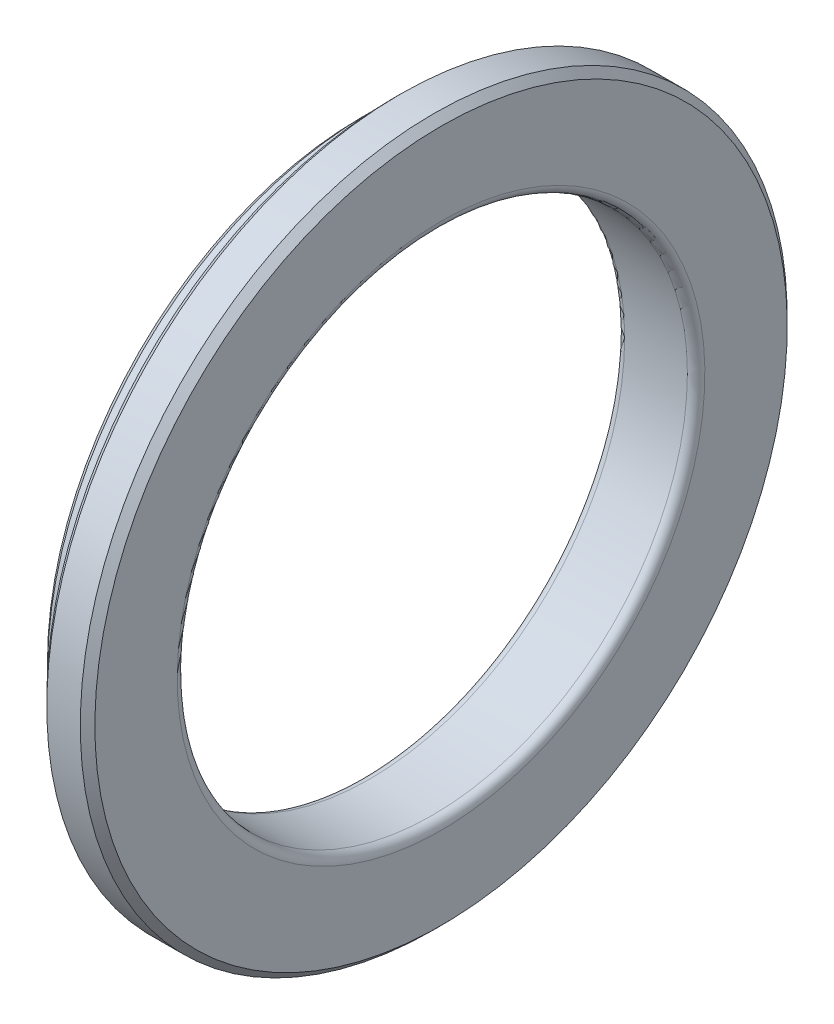
ISO-10303-21;
HEADER;
FILE_DESCRIPTION(('STEP AP214'),'2;1');
FILE_NAME('part.step','',(''),(''),'','','');
FILE_SCHEMA(('AUTOMOTIVE_DESIGN { 1 0 10303 214 1 1 1 1 }'));
ENDSEC;
DATA;
#1=APPLICATION_CONTEXT('core data for automotive mechanical design processes');
#2=APPLICATION_PROTOCOL_DEFINITION('international standard','automotive_design',2000,#1);
#3=PRODUCT_CONTEXT('',#1,'mechanical');
#4=PRODUCT('Part','Part','',(#3));
#5=PRODUCT_RELATED_PRODUCT_CATEGORY('part','',(#4));
#6=PRODUCT_DEFINITION_FORMATION('','',#4);
#7=PRODUCT_DEFINITION_CONTEXT('part definition',#1,'design');
#8=PRODUCT_DEFINITION('design','',#6,#7);
#9=PRODUCT_DEFINITION_SHAPE('','',#8);
#10=(LENGTH_UNIT() NAMED_UNIT(*) SI_UNIT(.MILLI.,.METRE.));
#11=(NAMED_UNIT(*) PLANE_ANGLE_UNIT() SI_UNIT($,.RADIAN.));
#12=(NAMED_UNIT(*) SI_UNIT($,.STERADIAN.) SOLID_ANGLE_UNIT());
#13=UNCERTAINTY_MEASURE_WITH_UNIT(LENGTH_MEASURE(1.E-05),#10,'distance_accuracy_value','');
#14=(GEOMETRIC_REPRESENTATION_CONTEXT(3) GLOBAL_UNCERTAINTY_ASSIGNED_CONTEXT((#13)) GLOBAL_UNIT_ASSIGNED_CONTEXT((#10,
#11,#12)) REPRESENTATION_CONTEXT('',''));
#15=CARTESIAN_POINT('',(0.,0.,0.));
#16=DIRECTION('',(0.,0.,1.));
#17=DIRECTION('',(1.,0.,0.));
#18=AXIS2_PLACEMENT_3D('',#15,#16,#17);
#19=CARTESIAN_POINT('',(-0.25,0.,0.));
#20=DIRECTION('',(1.,0.,0.));
#21=DIRECTION('',(0.,1.,0.));
#22=AXIS2_PLACEMENT_3D('',#19,#20,#21);
#23=CONICAL_SURFACE('',#22,21.75,0.785398163397448);
#24=CARTESIAN_POINT('',(0.,0.,0.));
#25=DIRECTION('',(-1.,0.,0.));
#26=DIRECTION('',(0.,1.,0.));
#27=AXIS2_PLACEMENT_3D('',#24,#25,#26);
#28=CIRCLE('',#27,22.);
#29=CARTESIAN_POINT('',(0.,22.,0.));
#30=VERTEX_POINT('',#29);
#31=EDGE_CURVE('E11',#30,#30,#28,.T.);
#32=ORIENTED_EDGE('',*,*,#31,.T.);
#33=EDGE_LOOP('',(#32));
#34=FACE_BOUND('',#33,.T.);
#35=CARTESIAN_POINT('',(-0.5,0.,0.));
#36=DIRECTION('',(-1.,0.,0.));
#37=DIRECTION('',(0.,1.,0.));
#38=AXIS2_PLACEMENT_3D('',#35,#36,#37);
#39=CIRCLE('',#38,21.5);
#40=CARTESIAN_POINT('',(-0.5,21.5,0.));
#41=VERTEX_POINT('',#40);
#42=EDGE_CURVE('E80',#41,#41,#39,.T.);
#43=ORIENTED_EDGE('',*,*,#42,.F.);
#44=EDGE_LOOP('',(#43));
#45=FACE_BOUND('',#44,.T.);
#46=ADVANCED_FACE('F17',(#34,#45),#23,.T.);
#47=CARTESIAN_POINT('',(0.85,0.,0.));
#48=DIRECTION('',(1.,0.,0.));
#49=DIRECTION('',(0.,1.,0.));
#50=AXIS2_PLACEMENT_3D('',#47,#48,#49);
#51=CYLINDRICAL_SURFACE('',#50,22.);
#52=CARTESIAN_POINT('',(1.7,0.,0.));
#53=DIRECTION('',(-1.,0.,0.));
#54=DIRECTION('',(0.,1.,0.));
#55=AXIS2_PLACEMENT_3D('',#52,#53,#54);
#56=CIRCLE('',#55,22.);
#57=CARTESIAN_POINT('',(1.7,22.,0.));
#58=VERTEX_POINT('',#57);
#59=EDGE_CURVE('E27',#58,#58,#56,.T.);
#60=ORIENTED_EDGE('',*,*,#59,.T.);
#61=EDGE_LOOP('',(#60));
#62=FACE_BOUND('',#61,.T.);
#63=ORIENTED_EDGE('',*,*,#31,.F.);
#64=EDGE_LOOP('',(#63));
#65=FACE_BOUND('',#64,.T.);
#66=ADVANCED_FACE('F92',(#62,#65),#51,.T.);
#67=CARTESIAN_POINT('',(1.7,22.875,0.));
#68=DIRECTION('',(-1.,0.,0.));
#69=DIRECTION('',(0.,1.,0.));
#70=AXIS2_PLACEMENT_3D('',#67,#68,#69);
#71=PLANE('',#70);
#72=CARTESIAN_POINT('',(1.7,0.,0.));
#73=DIRECTION('',(-1.,0.,0.));
#74=DIRECTION('',(0.,1.,0.));
#75=AXIS2_PLACEMENT_3D('',#72,#73,#74);
#76=CIRCLE('',#75,23.75);
#77=CARTESIAN_POINT('',(1.7,23.75,0.));
#78=VERTEX_POINT('',#77);
#79=EDGE_CURVE('E58',#78,#78,#76,.T.);
#80=ORIENTED_EDGE('',*,*,#79,.T.);
#81=EDGE_LOOP('',(#80));
#82=FACE_BOUND('',#81,.T.);
#83=ORIENTED_EDGE('',*,*,#59,.F.);
#84=EDGE_LOOP('',(#83));
#85=FACE_BOUND('',#84,.T.);
#86=ADVANCED_FACE('F19',(#82,#85),#71,.T.);
#87=CARTESIAN_POINT('',(1.95,0.,0.));
#88=DIRECTION('',(1.,0.,0.));
#89=DIRECTION('',(0.,1.,0.));
#90=AXIS2_PLACEMENT_3D('',#87,#88,#89);
#91=CONICAL_SURFACE('',#90,24.,0.785398163397448);
#92=CARTESIAN_POINT('',(2.2,0.,0.));
#93=DIRECTION('',(-1.,0.,0.));
#94=DIRECTION('',(0.,1.,0.));
#95=AXIS2_PLACEMENT_3D('',#92,#93,#94);
#96=CIRCLE('',#95,24.25);
#97=CARTESIAN_POINT('',(2.2,24.25,0.));
#98=VERTEX_POINT('',#97);
#99=EDGE_CURVE('E62',#98,#98,#96,.T.);
#100=ORIENTED_EDGE('',*,*,#99,.T.);
#101=EDGE_LOOP('',(#100));
#102=FACE_BOUND('',#101,.T.);
#103=ORIENTED_EDGE('',*,*,#79,.F.);
#104=EDGE_LOOP('',(#103));
#105=FACE_BOUND('',#104,.T.);
#106=ADVANCED_FACE('F96',(#102,#105),#91,.T.);
#107=CARTESIAN_POINT('',(3.35,0.,0.));
#108=DIRECTION('',(1.,0.,0.));
#109=DIRECTION('',(0.,1.,0.));
#110=AXIS2_PLACEMENT_3D('',#107,#108,#109);
#111=CYLINDRICAL_SURFACE('',#110,24.25);
#112=CARTESIAN_POINT('',(4.5,0.,0.));
#113=DIRECTION('',(-1.,0.,0.));
#114=DIRECTION('',(0.,1.,0.));
#115=AXIS2_PLACEMENT_3D('',#112,#113,#114);
#116=CIRCLE('',#115,24.25);
#117=CARTESIAN_POINT('',(4.5,24.25,0.));
#118=VERTEX_POINT('',#117);
#119=EDGE_CURVE('E21',#118,#118,#116,.T.);
#120=ORIENTED_EDGE('',*,*,#119,.T.);
#121=EDGE_LOOP('',(#120));
#122=FACE_BOUND('',#121,.T.);
#123=ORIENTED_EDGE('',*,*,#99,.F.);
#124=EDGE_LOOP('',(#123));
#125=FACE_BOUND('',#124,.T.);
#126=ADVANCED_FACE('F66',(#122,#125),#111,.T.);
#127=CARTESIAN_POINT('',(4.75,0.,0.));
#128=DIRECTION('',(-1.,0.,0.));
#129=DIRECTION('',(0.,1.,0.));
#130=AXIS2_PLACEMENT_3D('',#127,#128,#129);
#131=CONICAL_SURFACE('',#130,24.,0.785398163397448);
#132=CARTESIAN_POINT('',(5.,0.,0.));
#133=DIRECTION('',(-1.,0.,0.));
#134=DIRECTION('',(0.,1.,0.));
#135=AXIS2_PLACEMENT_3D('',#132,#133,#134);
#136=CIRCLE('',#135,23.75);
#137=CARTESIAN_POINT('',(5.,23.75,0.));
#138=VERTEX_POINT('',#137);
#139=EDGE_CURVE('E69',#138,#138,#136,.T.);
#140=ORIENTED_EDGE('',*,*,#139,.T.);
#141=EDGE_LOOP('',(#140));
#142=FACE_BOUND('',#141,.T.);
#143=ORIENTED_EDGE('',*,*,#119,.F.);
#144=EDGE_LOOP('',(#143));
#145=FACE_BOUND('',#144,.T.);
#146=ADVANCED_FACE('F119',(#142,#145),#131,.T.);
#147=CARTESIAN_POINT('',(5.,20.925,0.));
#148=DIRECTION('',(1.,0.,0.));
#149=DIRECTION('',(0.,-1.,0.));
#150=AXIS2_PLACEMENT_3D('',#147,#148,#149);
#151=PLANE('',#150);
#152=CARTESIAN_POINT('',(5.,0.,0.));
#153=DIRECTION('',(-1.,0.,0.));
#154=DIRECTION('',(0.,1.,0.));
#155=AXIS2_PLACEMENT_3D('',#152,#153,#154);
#156=CIRCLE('',#155,18.1);
#157=CARTESIAN_POINT('',(5.,18.1,0.));
#158=VERTEX_POINT('',#157);
#159=EDGE_CURVE('E71',#158,#158,#156,.T.);
#160=ORIENTED_EDGE('',*,*,#159,.T.);
#161=EDGE_LOOP('',(#160));
#162=FACE_BOUND('',#161,.T.);
#163=ORIENTED_EDGE('',*,*,#139,.F.);
#164=EDGE_LOOP('',(#163));
#165=FACE_BOUND('',#164,.T.);
#166=ADVANCED_FACE('F121',(#162,#165),#151,.T.);
#167=CARTESIAN_POINT('',(4.4,0.,0.));
#168=DIRECTION('',(-1.,0.,0.));
#169=DIRECTION('',(0.,0.,1.));
#170=AXIS2_PLACEMENT_3D('',#167,#168,#169);
#171=TOROIDAL_SURFACE('',#170,18.1,0.6);
#172=CARTESIAN_POINT('',(4.4,0.,0.));
#173=DIRECTION('',(-1.,0.,0.));
#174=DIRECTION('',(0.,1.,0.));
#175=AXIS2_PLACEMENT_3D('',#172,#173,#174);
#176=CIRCLE('',#175,17.5);
#177=CARTESIAN_POINT('',(4.4,17.5,0.));
#178=VERTEX_POINT('',#177);
#179=EDGE_CURVE('E75',#178,#178,#176,.T.);
#180=ORIENTED_EDGE('',*,*,#179,.T.);
#181=EDGE_LOOP('',(#180));
#182=FACE_BOUND('',#181,.T.);
#183=ORIENTED_EDGE('',*,*,#159,.F.);
#184=EDGE_LOOP('',(#183));
#185=FACE_BOUND('',#184,.T.);
#186=ADVANCED_FACE('F110',(#182,#185),#171,.T.);
#187=CARTESIAN_POINT('',(2.25,0.,0.));
#188=DIRECTION('',(1.,0.,0.));
#189=DIRECTION('',(0.,1.,0.));
#190=AXIS2_PLACEMENT_3D('',#187,#188,#189);
#191=CYLINDRICAL_SURFACE('',#190,17.5);
#192=CARTESIAN_POINT('',(0.1,0.,0.));
#193=DIRECTION('',(-1.,0.,0.));
#194=DIRECTION('',(0.,1.,0.));
#195=AXIS2_PLACEMENT_3D('',#192,#193,#194);
#196=CIRCLE('',#195,17.5);
#197=CARTESIAN_POINT('',(0.1,17.5,0.));
#198=VERTEX_POINT('',#197);
#199=EDGE_CURVE('E82',#198,#198,#196,.T.);
#200=ORIENTED_EDGE('',*,*,#199,.T.);
#201=EDGE_LOOP('',(#200));
#202=FACE_BOUND('',#201,.T.);
#203=ORIENTED_EDGE('',*,*,#179,.F.);
#204=EDGE_LOOP('',(#203));
#205=FACE_BOUND('',#204,.T.);
#206=ADVANCED_FACE('F117',(#202,#205),#191,.F.);
#207=CARTESIAN_POINT('',(0.1,0.,0.));
#208=DIRECTION('',(-1.,0.,0.));
#209=DIRECTION('',(0.,0.,1.));
#210=AXIS2_PLACEMENT_3D('',#207,#208,#209);
#211=TOROIDAL_SURFACE('',#210,18.1,0.6);
#212=CARTESIAN_POINT('',(-0.5,0.,0.));
#213=DIRECTION('',(-1.,0.,0.));
#214=DIRECTION('',(0.,1.,0.));
#215=AXIS2_PLACEMENT_3D('',#212,#213,#214);
#216=CIRCLE('',#215,18.1);
#217=CARTESIAN_POINT('',(-0.5,18.1,0.));
#218=VERTEX_POINT('',#217);
#219=EDGE_CURVE('E79',#218,#218,#216,.T.);
#220=ORIENTED_EDGE('',*,*,#219,.T.);
#221=EDGE_LOOP('',(#220));
#222=FACE_BOUND('',#221,.T.);
#223=ORIENTED_EDGE('',*,*,#199,.F.);
#224=EDGE_LOOP('',(#223));
#225=FACE_BOUND('',#224,.T.);
#226=ADVANCED_FACE('F113',(#222,#225),#211,.T.);
#227=CARTESIAN_POINT('',(-0.5,19.8,0.));
#228=DIRECTION('',(-1.,0.,0.));
#229=DIRECTION('',(0.,1.,0.));
#230=AXIS2_PLACEMENT_3D('',#227,#228,#229);
#231=PLANE('',#230);
#232=ORIENTED_EDGE('',*,*,#42,.T.);
#233=EDGE_LOOP('',(#232));
#234=FACE_BOUND('',#233,.T.);
#235=ORIENTED_EDGE('',*,*,#219,.F.);
#236=EDGE_LOOP('',(#235));
#237=FACE_BOUND('',#236,.T.);
#238=ADVANCED_FACE('F116',(#234,#237),#231,.T.);
#239=CLOSED_SHELL('',(#46,#66,#86,#106,#126,#146,#166,#186,#206,#226,#238));
#240=MANIFOLD_SOLID_BREP('B1',#239);
#241=ADVANCED_BREP_SHAPE_REPRESENTATION('',(#18,#240),#14);
#242=SHAPE_DEFINITION_REPRESENTATION(#9,#241);
ENDSEC;
END-ISO-10303-21;
